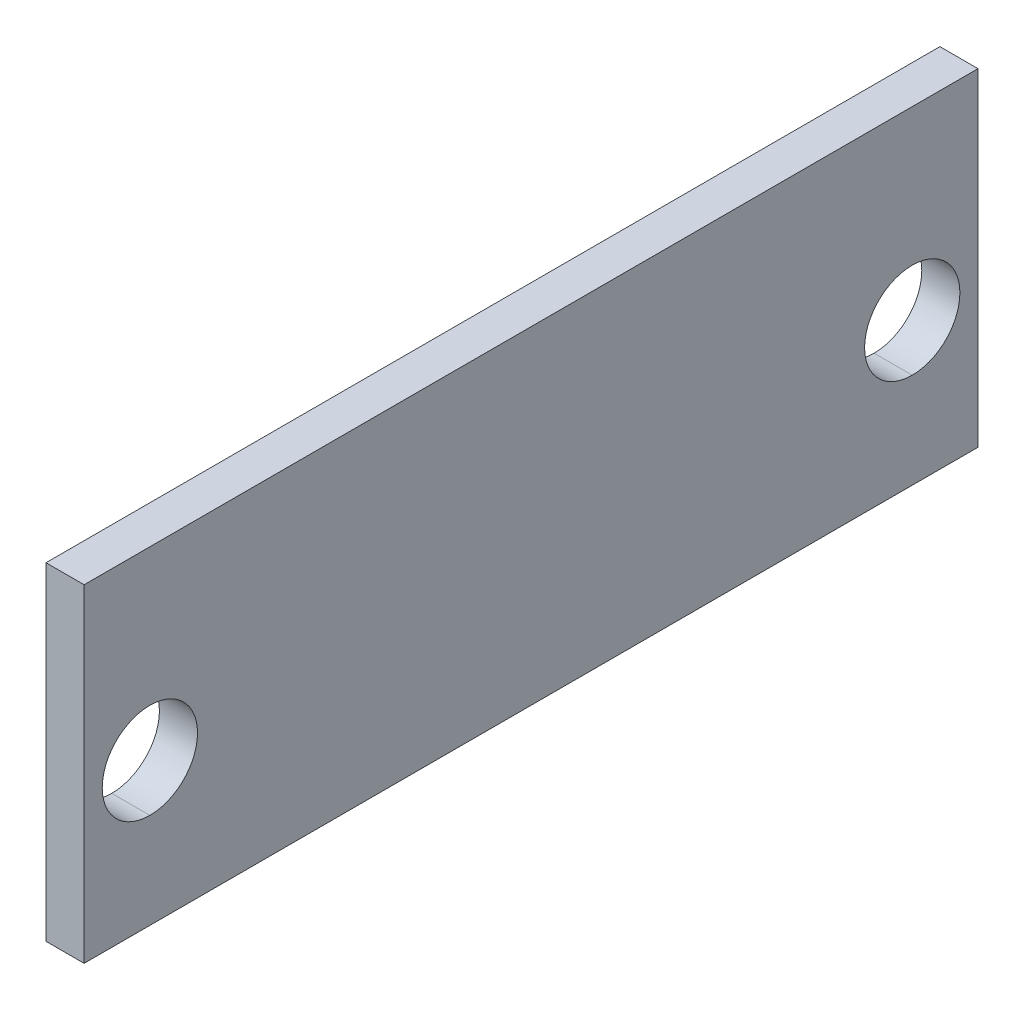
ISO-10303-21;
HEADER;
FILE_DESCRIPTION(('STEP AP214'),'2;1');
FILE_NAME('part.step','',(''),(''),'','','');
FILE_SCHEMA(('AUTOMOTIVE_DESIGN { 1 0 10303 214 1 1 1 1 }'));
ENDSEC;
DATA;
#1=APPLICATION_CONTEXT('core data for automotive mechanical design processes');
#2=APPLICATION_PROTOCOL_DEFINITION('international standard','automotive_design',2000,#1);
#3=PRODUCT_CONTEXT('',#1,'mechanical');
#4=PRODUCT('Part','Part','',(#3));
#5=PRODUCT_RELATED_PRODUCT_CATEGORY('part','',(#4));
#6=PRODUCT_DEFINITION_FORMATION('','',#4);
#7=PRODUCT_DEFINITION_CONTEXT('part definition',#1,'design');
#8=PRODUCT_DEFINITION('design','',#6,#7);
#9=PRODUCT_DEFINITION_SHAPE('','',#8);
#10=(LENGTH_UNIT() NAMED_UNIT(*) SI_UNIT(.MILLI.,.METRE.));
#11=(NAMED_UNIT(*) PLANE_ANGLE_UNIT() SI_UNIT($,.RADIAN.));
#12=(NAMED_UNIT(*) SI_UNIT($,.STERADIAN.) SOLID_ANGLE_UNIT());
#13=UNCERTAINTY_MEASURE_WITH_UNIT(LENGTH_MEASURE(1.E-05),#10,'distance_accuracy_value','');
#14=(GEOMETRIC_REPRESENTATION_CONTEXT(3) GLOBAL_UNCERTAINTY_ASSIGNED_CONTEXT((#13)) GLOBAL_UNIT_ASSIGNED_CONTEXT((#10,
#11,#12)) REPRESENTATION_CONTEXT('',''));
#15=CARTESIAN_POINT('',(0.,0.,0.));
#16=DIRECTION('',(0.,0.,1.));
#17=DIRECTION('',(1.,0.,0.));
#18=AXIS2_PLACEMENT_3D('',#15,#16,#17);
#19=CARTESIAN_POINT('',(10.,0.,0.));
#20=DIRECTION('',(1.,0.,0.));
#21=DIRECTION('',(0.,1.,0.));
#22=AXIS2_PLACEMENT_3D('',#19,#20,#21);
#23=PLANE('',#22);
#24=CARTESIAN_POINT('',(10.,0.,-200.));
#25=DIRECTION('',(1.,0.,0.));
#26=DIRECTION('',(0.,1.,0.));
#27=AXIS2_PLACEMENT_3D('',#24,#25,#26);
#28=CIRCLE('',#27,25.);
#29=CARTESIAN_POINT('',(10.,-25.,-200.));
#30=VERTEX_POINT('',#29);
#31=CARTESIAN_POINT('',(10.,25.,-200.));
#32=VERTEX_POINT('',#31);
#33=EDGE_CURVE('E184',#30,#32,#28,.T.);
#34=ORIENTED_EDGE('',*,*,#33,.F.);
#35=CARTESIAN_POINT('',(10.,0.,-200.));
#36=DIRECTION('',(1.,0.,0.));
#37=DIRECTION('',(0.,1.,0.));
#38=AXIS2_PLACEMENT_3D('',#35,#36,#37);
#39=CIRCLE('',#38,25.);
#40=EDGE_CURVE('E19',#32,#30,#39,.T.);
#41=ORIENTED_EDGE('',*,*,#40,.F.);
#42=EDGE_LOOP('',(#34,#41));
#43=FACE_BOUND('',#42,.T.);
#44=CARTESIAN_POINT('',(10.,0.,200.));
#45=DIRECTION('',(1.,0.,0.));
#46=DIRECTION('',(0.,1.,0.));
#47=AXIS2_PLACEMENT_3D('',#44,#45,#46);
#48=CIRCLE('',#47,25.);
#49=CARTESIAN_POINT('',(10.,-25.,200.));
#50=VERTEX_POINT('',#49);
#51=CARTESIAN_POINT('',(10.,25.,200.));
#52=VERTEX_POINT('',#51);
#53=EDGE_CURVE('E163',#50,#52,#48,.T.);
#54=ORIENTED_EDGE('',*,*,#53,.F.);
#55=CARTESIAN_POINT('',(10.,0.,200.));
#56=DIRECTION('',(1.,0.,0.));
#57=DIRECTION('',(0.,1.,0.));
#58=AXIS2_PLACEMENT_3D('',#55,#56,#57);
#59=CIRCLE('',#58,25.);
#60=EDGE_CURVE('E177',#52,#50,#59,.T.);
#61=ORIENTED_EDGE('',*,*,#60,.F.);
#62=EDGE_LOOP('',(#54,#61));
#63=FACE_BOUND('',#62,.T.);
#64=DIRECTION('',(0.,0.,-1.));
#65=VECTOR('',#64,1.);
#66=CARTESIAN_POINT('',(10.,-74.9929962158,0.));
#67=LINE('',#66,#65);
#68=CARTESIAN_POINT('',(10.,-74.9929962158,234.5));
#69=VERTEX_POINT('',#68);
#70=CARTESIAN_POINT('',(10.,-74.9929962158,-234.5));
#71=VERTEX_POINT('',#70);
#72=EDGE_CURVE('E135',#69,#71,#67,.T.);
#73=ORIENTED_EDGE('',*,*,#72,.T.);
#74=DIRECTION('',(0.,1.,0.));
#75=VECTOR('',#74,1.);
#76=CARTESIAN_POINT('',(10.,11.0283813477,-234.5));
#77=LINE('',#76,#75);
#78=CARTESIAN_POINT('',(10.,97.0497589111,-234.5));
#79=VERTEX_POINT('',#78);
#80=EDGE_CURVE('E155',#71,#79,#77,.T.);
#81=ORIENTED_EDGE('',*,*,#80,.T.);
#82=DIRECTION('',(0.,0.,1.));
#83=VECTOR('',#82,1.);
#84=CARTESIAN_POINT('',(10.,97.0497589111,0.));
#85=LINE('',#84,#83);
#86=CARTESIAN_POINT('',(10.,97.0497589111,234.5));
#87=VERTEX_POINT('',#86);
#88=EDGE_CURVE('E119',#79,#87,#85,.T.);
#89=ORIENTED_EDGE('',*,*,#88,.T.);
#90=DIRECTION('',(0.,-1.,0.));
#91=VECTOR('',#90,1.);
#92=CARTESIAN_POINT('',(10.,11.0283813477,234.5));
#93=LINE('',#92,#91);
#94=EDGE_CURVE('E118',#87,#69,#93,.T.);
#95=ORIENTED_EDGE('',*,*,#94,.T.);
#96=EDGE_LOOP('',(#73,#81,#89,#95));
#97=FACE_BOUND('',#96,.T.);
#98=ADVANCED_FACE('F16',(#43,#63,#97),#23,.T.);
#99=CARTESIAN_POINT('',(-10.,0.,0.));
#100=DIRECTION('',(1.,0.,0.));
#101=DIRECTION('',(0.,1.,0.));
#102=AXIS2_PLACEMENT_3D('',#99,#100,#101);
#103=PLANE('',#102);
#104=CARTESIAN_POINT('',(-10.,0.,-200.));
#105=DIRECTION('',(1.,0.,0.));
#106=DIRECTION('',(0.,1.,0.));
#107=AXIS2_PLACEMENT_3D('',#104,#105,#106);
#108=CIRCLE('',#107,25.);
#109=CARTESIAN_POINT('',(-10.,25.,-200.));
#110=VERTEX_POINT('',#109);
#111=CARTESIAN_POINT('',(-10.,-25.,-200.));
#112=VERTEX_POINT('',#111);
#113=EDGE_CURVE('E11',#110,#112,#108,.T.);
#114=ORIENTED_EDGE('',*,*,#113,.T.);
#115=CARTESIAN_POINT('',(-10.,0.,-200.));
#116=DIRECTION('',(1.,0.,0.));
#117=DIRECTION('',(0.,1.,0.));
#118=AXIS2_PLACEMENT_3D('',#115,#116,#117);
#119=CIRCLE('',#118,25.);
#120=EDGE_CURVE('E190',#112,#110,#119,.T.);
#121=ORIENTED_EDGE('',*,*,#120,.T.);
#122=EDGE_LOOP('',(#114,#121));
#123=FACE_BOUND('',#122,.T.);
#124=CARTESIAN_POINT('',(-10.,0.,200.));
#125=DIRECTION('',(1.,0.,0.));
#126=DIRECTION('',(0.,1.,0.));
#127=AXIS2_PLACEMENT_3D('',#124,#125,#126);
#128=CIRCLE('',#127,25.);
#129=CARTESIAN_POINT('',(-10.,25.,200.));
#130=VERTEX_POINT('',#129);
#131=CARTESIAN_POINT('',(-10.,-25.,200.));
#132=VERTEX_POINT('',#131);
#133=EDGE_CURVE('E58',#130,#132,#128,.T.);
#134=ORIENTED_EDGE('',*,*,#133,.T.);
#135=CARTESIAN_POINT('',(-10.,0.,200.));
#136=DIRECTION('',(1.,0.,0.));
#137=DIRECTION('',(0.,1.,0.));
#138=AXIS2_PLACEMENT_3D('',#135,#136,#137);
#139=CIRCLE('',#138,25.);
#140=EDGE_CURVE('E162',#132,#130,#139,.T.);
#141=ORIENTED_EDGE('',*,*,#140,.T.);
#142=EDGE_LOOP('',(#134,#141));
#143=FACE_BOUND('',#142,.T.);
#144=DIRECTION('',(0.,-1.,0.));
#145=VECTOR('',#144,1.);
#146=CARTESIAN_POINT('',(-10.,11.0283813477,234.5));
#147=LINE('',#146,#145);
#148=CARTESIAN_POINT('',(-10.,97.0497589111,234.5));
#149=VERTEX_POINT('',#148);
#150=CARTESIAN_POINT('',(-10.,-74.9929962158,234.5));
#151=VERTEX_POINT('',#150);
#152=EDGE_CURVE('E108',#149,#151,#147,.T.);
#153=ORIENTED_EDGE('',*,*,#152,.F.);
#154=DIRECTION('',(0.,0.,1.));
#155=VECTOR('',#154,1.);
#156=CARTESIAN_POINT('',(-10.,97.0497589111,0.));
#157=LINE('',#156,#155);
#158=CARTESIAN_POINT('',(-10.,97.0497589111,-234.5));
#159=VERTEX_POINT('',#158);
#160=EDGE_CURVE('E144',#159,#149,#157,.T.);
#161=ORIENTED_EDGE('',*,*,#160,.F.);
#162=DIRECTION('',(0.,1.,0.));
#163=VECTOR('',#162,1.);
#164=CARTESIAN_POINT('',(-10.,11.0283813477,-234.5));
#165=LINE('',#164,#163);
#166=CARTESIAN_POINT('',(-10.,-74.9929962158,-234.5));
#167=VERTEX_POINT('',#166);
#168=EDGE_CURVE('E125',#167,#159,#165,.T.);
#169=ORIENTED_EDGE('',*,*,#168,.F.);
#170=DIRECTION('',(0.,0.,-1.));
#171=VECTOR('',#170,1.);
#172=CARTESIAN_POINT('',(-10.,-74.9929962158,0.));
#173=LINE('',#172,#171);
#174=EDGE_CURVE('E122',#151,#167,#173,.T.);
#175=ORIENTED_EDGE('',*,*,#174,.F.);
#176=EDGE_LOOP('',(#153,#161,#169,#175));
#177=FACE_BOUND('',#176,.T.);
#178=ADVANCED_FACE('F123',(#123,#143,#177),#103,.F.);
#179=CARTESIAN_POINT('',(0.,0.,-200.));
#180=DIRECTION('',(1.,0.,0.));
#181=DIRECTION('',(0.,1.,0.));
#182=AXIS2_PLACEMENT_3D('',#179,#180,#181);
#183=CYLINDRICAL_SURFACE('',#182,25.);
#184=ORIENTED_EDGE('',*,*,#40,.T.);
#185=DIRECTION('',(1.,0.,0.));
#186=VECTOR('',#185,1.);
#187=CARTESIAN_POINT('',(0.,-25.,-200.));
#188=LINE('',#187,#186);
#189=EDGE_CURVE('E191',#112,#30,#188,.T.);
#190=ORIENTED_EDGE('',*,*,#189,.F.);
#191=ORIENTED_EDGE('',*,*,#113,.F.);
#192=DIRECTION('',(1.,0.,0.));
#193=VECTOR('',#192,1.);
#194=CARTESIAN_POINT('',(0.,25.,-200.));
#195=LINE('',#194,#193);
#196=EDGE_CURVE('E188',#110,#32,#195,.T.);
#197=ORIENTED_EDGE('',*,*,#196,.T.);
#198=EDGE_LOOP('',(#184,#190,#191,#197));
#199=FACE_BOUND('',#198,.T.);
#200=ADVANCED_FACE('F202',(#199),#183,.F.);
#201=CARTESIAN_POINT('',(0.,0.,-200.));
#202=DIRECTION('',(1.,0.,0.));
#203=DIRECTION('',(0.,1.,0.));
#204=AXIS2_PLACEMENT_3D('',#201,#202,#203);
#205=CYLINDRICAL_SURFACE('',#204,25.);
#206=ORIENTED_EDGE('',*,*,#33,.T.);
#207=ORIENTED_EDGE('',*,*,#196,.F.);
#208=ORIENTED_EDGE('',*,*,#120,.F.);
#209=ORIENTED_EDGE('',*,*,#189,.T.);
#210=EDGE_LOOP('',(#206,#207,#208,#209));
#211=FACE_BOUND('',#210,.T.);
#212=ADVANCED_FACE('F201',(#211),#205,.F.);
#213=CARTESIAN_POINT('',(0.,0.,200.));
#214=DIRECTION('',(1.,0.,0.));
#215=DIRECTION('',(0.,1.,0.));
#216=AXIS2_PLACEMENT_3D('',#213,#214,#215);
#217=CYLINDRICAL_SURFACE('',#216,25.);
#218=ORIENTED_EDGE('',*,*,#60,.T.);
#219=DIRECTION('',(1.,0.,0.));
#220=VECTOR('',#219,1.);
#221=CARTESIAN_POINT('',(0.,-25.,200.));
#222=LINE('',#221,#220);
#223=EDGE_CURVE('E173',#132,#50,#222,.T.);
#224=ORIENTED_EDGE('',*,*,#223,.F.);
#225=ORIENTED_EDGE('',*,*,#133,.F.);
#226=DIRECTION('',(1.,0.,0.));
#227=VECTOR('',#226,1.);
#228=CARTESIAN_POINT('',(0.,25.,200.));
#229=LINE('',#228,#227);
#230=EDGE_CURVE('E159',#130,#52,#229,.T.);
#231=ORIENTED_EDGE('',*,*,#230,.T.);
#232=EDGE_LOOP('',(#218,#224,#225,#231));
#233=FACE_BOUND('',#232,.T.);
#234=ADVANCED_FACE('F210',(#233),#217,.F.);
#235=CARTESIAN_POINT('',(0.,0.,200.));
#236=DIRECTION('',(1.,0.,0.));
#237=DIRECTION('',(0.,1.,0.));
#238=AXIS2_PLACEMENT_3D('',#235,#236,#237);
#239=CYLINDRICAL_SURFACE('',#238,25.);
#240=ORIENTED_EDGE('',*,*,#53,.T.);
#241=ORIENTED_EDGE('',*,*,#230,.F.);
#242=ORIENTED_EDGE('',*,*,#140,.F.);
#243=ORIENTED_EDGE('',*,*,#223,.T.);
#244=EDGE_LOOP('',(#240,#241,#242,#243));
#245=FACE_BOUND('',#244,.T.);
#246=ADVANCED_FACE('F231',(#245),#239,.F.);
#247=CARTESIAN_POINT('',(0.,-74.9929962158,234.5));
#248=DIRECTION('',(0.,0.,-1.));
#249=DIRECTION('',(0.,-1.,0.));
#250=AXIS2_PLACEMENT_3D('',#247,#248,#249);
#251=PLANE('',#250);
#252=DIRECTION('',(1.,0.,0.));
#253=VECTOR('',#252,1.);
#254=CARTESIAN_POINT('',(0.,97.0497589111,234.5));
#255=LINE('',#254,#253);
#256=EDGE_CURVE('E114',#149,#87,#255,.T.);
#257=ORIENTED_EDGE('',*,*,#256,.F.);
#258=ORIENTED_EDGE('',*,*,#152,.T.);
#259=DIRECTION('',(1.,0.,0.));
#260=VECTOR('',#259,1.);
#261=CARTESIAN_POINT('',(0.,-74.9929962158,234.5));
#262=LINE('',#261,#260);
#263=EDGE_CURVE('E112',#151,#69,#262,.T.);
#264=ORIENTED_EDGE('',*,*,#263,.T.);
#265=ORIENTED_EDGE('',*,*,#94,.F.);
#266=EDGE_LOOP('',(#257,#258,#264,#265));
#267=FACE_BOUND('',#266,.T.);
#268=ADVANCED_FACE('F110',(#267),#251,.F.);
#269=CARTESIAN_POINT('',(0.,97.0497589111,-234.5));
#270=DIRECTION('',(0.,1.,0.));
#271=DIRECTION('',(1.,0.,0.));
#272=AXIS2_PLACEMENT_3D('',#269,#270,#271);
#273=PLANE('',#272);
#274=DIRECTION('',(1.,0.,0.));
#275=VECTOR('',#274,1.);
#276=CARTESIAN_POINT('',(0.,97.0497589111,-234.5));
#277=LINE('',#276,#275);
#278=EDGE_CURVE('E152',#159,#79,#277,.T.);
#279=ORIENTED_EDGE('',*,*,#278,.F.);
#280=ORIENTED_EDGE('',*,*,#160,.T.);
#281=ORIENTED_EDGE('',*,*,#256,.T.);
#282=ORIENTED_EDGE('',*,*,#88,.F.);
#283=EDGE_LOOP('',(#279,#280,#281,#282));
#284=FACE_BOUND('',#283,.T.);
#285=ADVANCED_FACE('F223',(#284),#273,.T.);
#286=CARTESIAN_POINT('',(0.,97.0497589111,-234.5));
#287=DIRECTION('',(0.,0.,1.));
#288=DIRECTION('',(1.,0.,0.));
#289=AXIS2_PLACEMENT_3D('',#286,#287,#288);
#290=PLANE('',#289);
#291=DIRECTION('',(1.,0.,0.));
#292=VECTOR('',#291,1.);
#293=CARTESIAN_POINT('',(0.,-74.9929962158,-234.5));
#294=LINE('',#293,#292);
#295=EDGE_CURVE('E130',#167,#71,#294,.T.);
#296=ORIENTED_EDGE('',*,*,#295,.F.);
#297=ORIENTED_EDGE('',*,*,#168,.T.);
#298=ORIENTED_EDGE('',*,*,#278,.T.);
#299=ORIENTED_EDGE('',*,*,#80,.F.);
#300=EDGE_LOOP('',(#296,#297,#298,#299));
#301=FACE_BOUND('',#300,.T.);
#302=ADVANCED_FACE('F220',(#301),#290,.F.);
#303=CARTESIAN_POINT('',(0.,-74.9929962158,234.5));
#304=DIRECTION('',(0.,-1.,0.));
#305=DIRECTION('',(0.,0.,-1.));
#306=AXIS2_PLACEMENT_3D('',#303,#304,#305);
#307=PLANE('',#306);
#308=ORIENTED_EDGE('',*,*,#263,.F.);
#309=ORIENTED_EDGE('',*,*,#174,.T.);
#310=ORIENTED_EDGE('',*,*,#295,.T.);
#311=ORIENTED_EDGE('',*,*,#72,.F.);
#312=EDGE_LOOP('',(#308,#309,#310,#311));
#313=FACE_BOUND('',#312,.T.);
#314=ADVANCED_FACE('F133',(#313),#307,.T.);
#315=CLOSED_SHELL('',(#98,#178,#200,#212,#234,#246,#268,#285,#302,#314));
#316=MANIFOLD_SOLID_BREP('B1',#315);
#317=ADVANCED_BREP_SHAPE_REPRESENTATION('',(#18,#316),#14);
#318=SHAPE_DEFINITION_REPRESENTATION(#9,#317);
ENDSEC;
END-ISO-10303-21;
